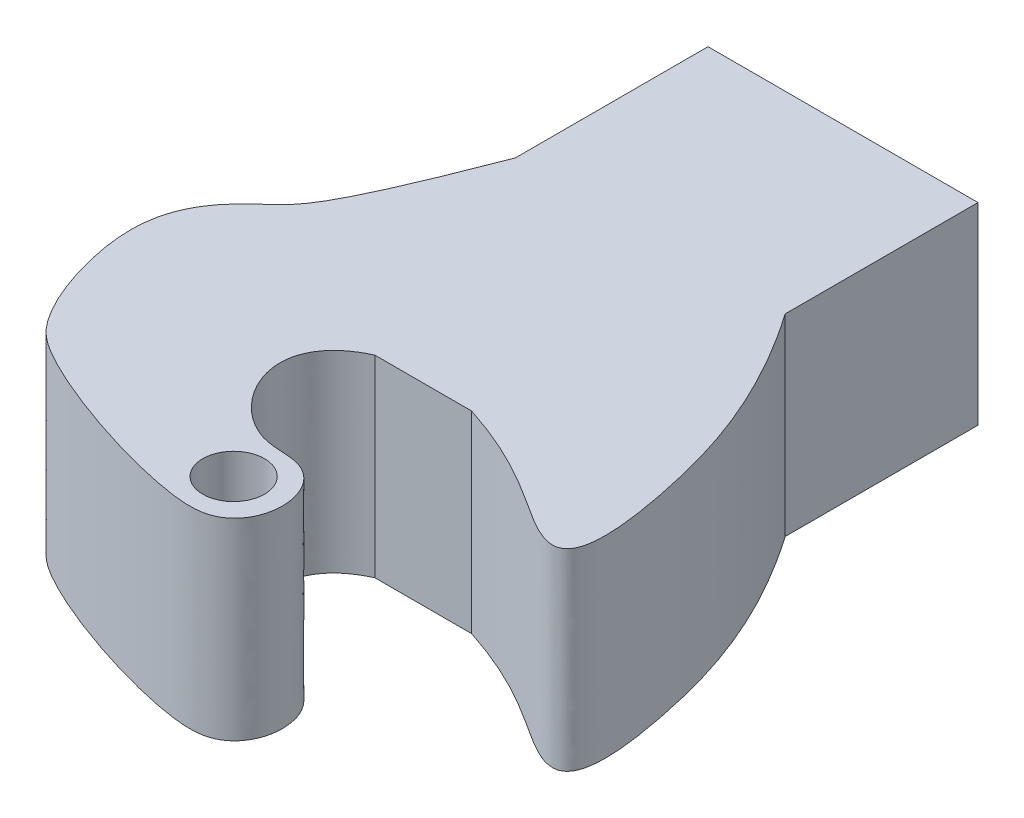
ISO-10303-21;
HEADER;
FILE_DESCRIPTION(('STEP AP214'),'2;1');
FILE_NAME('part.step','',(''),(''),'','','');
FILE_SCHEMA(('AUTOMOTIVE_DESIGN { 1 0 10303 214 1 1 1 1 }'));
ENDSEC;
DATA;
#1=APPLICATION_CONTEXT('core data for automotive mechanical design processes');
#2=APPLICATION_PROTOCOL_DEFINITION('international standard','automotive_design',2000,#1);
#3=PRODUCT_CONTEXT('',#1,'mechanical');
#4=PRODUCT('Part','Part','',(#3));
#5=PRODUCT_RELATED_PRODUCT_CATEGORY('part','',(#4));
#6=PRODUCT_DEFINITION_FORMATION('','',#4);
#7=PRODUCT_DEFINITION_CONTEXT('part definition',#1,'design');
#8=PRODUCT_DEFINITION('design','',#6,#7);
#9=PRODUCT_DEFINITION_SHAPE('','',#8);
#10=(LENGTH_UNIT() NAMED_UNIT(*) SI_UNIT(.MILLI.,.METRE.));
#11=(NAMED_UNIT(*) PLANE_ANGLE_UNIT() SI_UNIT($,.RADIAN.));
#12=(NAMED_UNIT(*) SI_UNIT($,.STERADIAN.) SOLID_ANGLE_UNIT());
#13=UNCERTAINTY_MEASURE_WITH_UNIT(LENGTH_MEASURE(1.E-05),#10,'distance_accuracy_value','');
#14=(GEOMETRIC_REPRESENTATION_CONTEXT(3) GLOBAL_UNCERTAINTY_ASSIGNED_CONTEXT((#13)) GLOBAL_UNIT_ASSIGNED_CONTEXT((#10,
#11,#12)) REPRESENTATION_CONTEXT('',''));
#15=CARTESIAN_POINT('',(0.,0.,0.));
#16=DIRECTION('',(0.,0.,1.));
#17=DIRECTION('',(1.,0.,0.));
#18=AXIS2_PLACEMENT_3D('',#15,#16,#17);
#19=CARTESIAN_POINT('',(175.,-125.,250.));
#20=DIRECTION('',(-1.,0.,0.));
#21=DIRECTION('',(0.,0.,1.));
#22=AXIS2_PLACEMENT_3D('',#19,#20,#21);
#23=PLANE('',#22);
#24=DIRECTION('',(0.,1.,0.));
#25=VECTOR('',#24,1.);
#26=CARTESIAN_POINT('',(175.,-125.,0.));
#27=LINE('',#26,#25);
#28=CARTESIAN_POINT('',(175.,-125.,0.));
#29=VERTEX_POINT('',#28);
#30=CARTESIAN_POINT('',(175.,125.,0.));
#31=VERTEX_POINT('',#30);
#32=EDGE_CURVE('E177',#29,#31,#27,.T.);
#33=ORIENTED_EDGE('',*,*,#32,.T.);
#34=DIRECTION('',(0.,0.,-1.));
#35=VECTOR('',#34,1.);
#36=CARTESIAN_POINT('',(175.,125.,250.));
#37=LINE('',#36,#35);
#38=CARTESIAN_POINT('',(175.,125.,250.));
#39=VERTEX_POINT('',#38);
#40=EDGE_CURVE('E11',#39,#31,#37,.T.);
#41=ORIENTED_EDGE('',*,*,#40,.F.);
#42=DIRECTION('',(0.,1.,0.));
#43=VECTOR('',#42,1.);
#44=CARTESIAN_POINT('',(175.,-125.,250.));
#45=LINE('',#44,#43);
#46=CARTESIAN_POINT('',(175.,-125.,250.));
#47=VERTEX_POINT('',#46);
#48=EDGE_CURVE('E179',#47,#39,#45,.T.);
#49=ORIENTED_EDGE('',*,*,#48,.F.);
#50=DIRECTION('',(0.,0.,-1.));
#51=VECTOR('',#50,1.);
#52=CARTESIAN_POINT('',(175.,-125.,250.));
#53=LINE('',#52,#51);
#54=EDGE_CURVE('E50',#47,#29,#53,.T.);
#55=ORIENTED_EDGE('',*,*,#54,.T.);
#56=EDGE_LOOP('',(#33,#41,#49,#55));
#57=FACE_BOUND('',#56,.T.);
#58=ADVANCED_FACE('F34',(#57),#23,.F.);
#59=CARTESIAN_POINT('',(-175.,125.,250.));
#60=DIRECTION('',(0.,-1.,0.));
#61=DIRECTION('',(0.,0.,-1.));
#62=AXIS2_PLACEMENT_3D('',#59,#60,#61);
#63=PLANE('',#62);
#64=DIRECTION('',(-1.,0.,0.));
#65=VECTOR('',#64,1.);
#66=CARTESIAN_POINT('',(-175.,125.,0.));
#67=LINE('',#66,#65);
#68=CARTESIAN_POINT('',(-175.,125.,0.));
#69=VERTEX_POINT('',#68);
#70=EDGE_CURVE('E156',#31,#69,#67,.T.);
#71=ORIENTED_EDGE('',*,*,#70,.T.);
#72=DIRECTION('',(0.,0.,-1.));
#73=VECTOR('',#72,1.);
#74=CARTESIAN_POINT('',(-175.,125.,250.));
#75=LINE('',#74,#73);
#76=CARTESIAN_POINT('',(-175.,125.,250.));
#77=VERTEX_POINT('',#76);
#78=EDGE_CURVE('E42',#77,#69,#75,.T.);
#79=ORIENTED_EDGE('',*,*,#78,.F.);
#80=CARTESIAN_POINT('',(-175.,125.,250.));
#81=CARTESIAN_POINT('',(-243.158689552223,125.,426.743473278941));
#82=CARTESIAN_POINT('',(-279.701762469466,125.,458.647578572171));
#83=CARTESIAN_POINT('',(-372.289259305635,125.,544.030243143078));
#84=CARTESIAN_POINT('',(-313.337421001662,125.,725.664643323685));
#85=CARTESIAN_POINT('',(-239.027684169651,125.,788.310970630175));
#86=CARTESIAN_POINT('',(-69.7669227205413,125.,847.841545559742));
#87=CARTESIAN_POINT('',(79.8248252096729,125.,857.588069072725));
#88=CARTESIAN_POINT('',(77.5307653460707,125.,724.034365353266));
#89=CARTESIAN_POINT('',(-68.9596639627069,125.,737.752024236189));
#90=CARTESIAN_POINT('',(-144.328050069521,125.,608.05483316108));
#91=CARTESIAN_POINT('',(-44.7617198290106,125.,562.257161455482));
#92=B_SPLINE_CURVE_WITH_KNOTS('',3,(#80,#81,#82,#83,#84,#85,#86,#87,#88,#89,#90,#91),
.UNSPECIFIED.,.F.,.F.,(4,1,1,1,1,1,1,1,1,4),(0.,0.137379521248285,0.290337807767186,
0.419114901732025,0.452202058869164,0.602430787997529,0.641831510394512,0.806808560442013,
0.844687622528155,1.),.UNSPECIFIED.);
#93=CARTESIAN_POINT('',(-44.7617198290149,125.,562.257161455484));
#94=VERTEX_POINT('',#93);
#95=EDGE_CURVE('E116',#77,#94,#92,.T.);
#96=ORIENTED_EDGE('',*,*,#95,.T.);
#97=DIRECTION('',(1.,0.,0.));
#98=VECTOR('',#97,1.);
#99=CARTESIAN_POINT('',(0.,125.,562.257161455484));
#100=LINE('',#99,#98);
#101=CARTESIAN_POINT('',(80.8956409538588,125.,562.257161455484));
#102=VERTEX_POINT('',#101);
#103=EDGE_CURVE('E161',#94,#102,#100,.T.);
#104=ORIENTED_EDGE('',*,*,#103,.T.);
#105=CARTESIAN_POINT('',(80.8956409538588,125.,562.257161455484));
#106=CARTESIAN_POINT('',(172.431287344357,125.,592.316314523608));
#107=CARTESIAN_POINT('',(262.31430280409,125.,669.613832445554));
#108=CARTESIAN_POINT('',(342.133537357133,125.,676.640646608673));
#109=CARTESIAN_POINT('',(255.419582956668,125.,365.169937009999));
#110=CARTESIAN_POINT('',(175.,125.,250.));
#111=B_SPLINE_CURVE_WITH_KNOTS('',3,(#105,#106,#107,#108,#109,#110),.UNSPECIFIED.,.F.,.F.,(4,1,
1,4),(0.,0.370060597977417,0.815514954714594,1.),.UNSPECIFIED.);
#112=EDGE_CURVE('E97',#102,#39,#111,.T.);
#113=ORIENTED_EDGE('',*,*,#112,.T.);
#114=ORIENTED_EDGE('',*,*,#40,.T.);
#115=EDGE_LOOP('',(#71,#79,#96,#104,#113,#114));
#116=FACE_BOUND('',#115,.T.);
#117=CARTESIAN_POINT('',(0.,125.,790.));
#118=DIRECTION('',(0.,1.,0.));
#119=DIRECTION('',(0.,0.,1.));
#120=AXIS2_PLACEMENT_3D('',#117,#118,#119);
#121=CIRCLE('',#120,40.);
#122=CARTESIAN_POINT('',(0.,125.,830.));
#123=VERTEX_POINT('',#122);
#124=EDGE_CURVE('E159',#123,#123,#121,.T.);
#125=ORIENTED_EDGE('',*,*,#124,.F.);
#126=EDGE_LOOP('',(#125));
#127=FACE_BOUND('',#126,.T.);
#128=ADVANCED_FACE('F148',(#116,#127),#63,.F.);
#129=CARTESIAN_POINT('',(-175.,-125.,250.));
#130=DIRECTION('',(1.,0.,0.));
#131=DIRECTION('',(0.,0.,-1.));
#132=AXIS2_PLACEMENT_3D('',#129,#130,#131);
#133=PLANE('',#132);
#134=DIRECTION('',(0.,-1.,0.));
#135=VECTOR('',#134,1.);
#136=CARTESIAN_POINT('',(-175.,-125.,0.));
#137=LINE('',#136,#135);
#138=CARTESIAN_POINT('',(-175.,-125.,0.));
#139=VERTEX_POINT('',#138);
#140=EDGE_CURVE('E68',#69,#139,#137,.T.);
#141=ORIENTED_EDGE('',*,*,#140,.T.);
#142=DIRECTION('',(0.,0.,-1.));
#143=VECTOR('',#142,1.);
#144=CARTESIAN_POINT('',(-175.,-125.,250.));
#145=LINE('',#144,#143);
#146=CARTESIAN_POINT('',(-175.,-125.,250.));
#147=VERTEX_POINT('',#146);
#148=EDGE_CURVE('E189',#147,#139,#145,.T.);
#149=ORIENTED_EDGE('',*,*,#148,.F.);
#150=DIRECTION('',(0.,-1.,0.));
#151=VECTOR('',#150,1.);
#152=CARTESIAN_POINT('',(-175.,-125.,250.));
#153=LINE('',#152,#151);
#154=EDGE_CURVE('E181',#77,#147,#153,.T.);
#155=ORIENTED_EDGE('',*,*,#154,.F.);
#156=ORIENTED_EDGE('',*,*,#78,.T.);
#157=EDGE_LOOP('',(#141,#149,#155,#156));
#158=FACE_BOUND('',#157,.T.);
#159=ADVANCED_FACE('F146',(#158),#133,.F.);
#160=CARTESIAN_POINT('',(-175.,-125.,250.));
#161=DIRECTION('',(0.,1.,0.));
#162=DIRECTION('',(0.,0.,1.));
#163=AXIS2_PLACEMENT_3D('',#160,#161,#162);
#164=PLANE('',#163);
#165=DIRECTION('',(1.,0.,0.));
#166=VECTOR('',#165,1.);
#167=CARTESIAN_POINT('',(-175.,-125.,0.));
#168=LINE('',#167,#166);
#169=EDGE_CURVE('E71',#139,#29,#168,.T.);
#170=ORIENTED_EDGE('',*,*,#169,.T.);
#171=ORIENTED_EDGE('',*,*,#54,.F.);
#172=CARTESIAN_POINT('',(80.8956409538588,-125.,562.257161455484));
#173=CARTESIAN_POINT('',(172.431287344357,-125.,592.316314523608));
#174=CARTESIAN_POINT('',(262.31430280409,-125.,669.613832445554));
#175=CARTESIAN_POINT('',(342.133537357133,-125.,676.640646608673));
#176=CARTESIAN_POINT('',(255.419582956668,-125.,365.169937009999));
#177=CARTESIAN_POINT('',(175.,-125.,250.));
#178=B_SPLINE_CURVE_WITH_KNOTS('',3,(#172,#173,#174,#175,#176,#177),.UNSPECIFIED.,.F.,.F.,(4,1,
1,4),(0.,0.370060597977417,0.815514954714594,1.),.UNSPECIFIED.);
#179=CARTESIAN_POINT('',(80.8956409538588,-125.,562.257161455484));
#180=VERTEX_POINT('',#179);
#181=EDGE_CURVE('E95',#180,#47,#178,.T.);
#182=ORIENTED_EDGE('',*,*,#181,.F.);
#183=DIRECTION('',(1.,0.,0.));
#184=VECTOR('',#183,1.);
#185=CARTESIAN_POINT('',(0.,-125.,562.257161455484));
#186=LINE('',#185,#184);
#187=CARTESIAN_POINT('',(-44.7617198290149,-125.,562.257161455484));
#188=VERTEX_POINT('',#187);
#189=EDGE_CURVE('E109',#188,#180,#186,.T.);
#190=ORIENTED_EDGE('',*,*,#189,.F.);
#191=CARTESIAN_POINT('',(-175.,-125.,250.));
#192=CARTESIAN_POINT('',(-243.158689552223,-125.,426.743473278941));
#193=CARTESIAN_POINT('',(-279.701762469466,-125.,458.647578572171));
#194=CARTESIAN_POINT('',(-372.289259305635,-125.,544.030243143078));
#195=CARTESIAN_POINT('',(-313.337421001662,-125.,725.664643323685));
#196=CARTESIAN_POINT('',(-239.027684169651,-125.,788.310970630175));
#197=CARTESIAN_POINT('',(-69.7669227205413,-125.,847.841545559742));
#198=CARTESIAN_POINT('',(79.8248252096729,-125.,857.588069072725));
#199=CARTESIAN_POINT('',(77.5307653460707,-125.,724.034365353266));
#200=CARTESIAN_POINT('',(-68.9596639627069,-125.,737.752024236189));
#201=CARTESIAN_POINT('',(-144.328050069521,-125.,608.05483316108));
#202=CARTESIAN_POINT('',(-44.7617198290106,-125.,562.257161455482));
#203=B_SPLINE_CURVE_WITH_KNOTS('',3,(#191,#192,#193,#194,#195,#196,#197,#198,#199,#200,#201,
#202),.UNSPECIFIED.,.F.,.F.,(4,1,1,1,1,1,1,1,1,4),(0.,0.137379521248285,0.290337807767186,
0.419114901732025,0.452202058869164,0.602430787997529,0.641831510394512,0.806808560442013,
0.844687622528155,1.),.UNSPECIFIED.);
#204=EDGE_CURVE('E103',#147,#188,#203,.T.);
#205=ORIENTED_EDGE('',*,*,#204,.F.);
#206=ORIENTED_EDGE('',*,*,#148,.T.);
#207=EDGE_LOOP('',(#170,#171,#182,#190,#205,#206));
#208=FACE_BOUND('',#207,.T.);
#209=CARTESIAN_POINT('',(0.,-125.,790.));
#210=DIRECTION('',(0.,1.,0.));
#211=DIRECTION('',(0.,0.,1.));
#212=AXIS2_PLACEMENT_3D('',#209,#210,#211);
#213=CIRCLE('',#212,40.);
#214=CARTESIAN_POINT('',(0.,-125.,830.));
#215=VERTEX_POINT('',#214);
#216=EDGE_CURVE('E113',#215,#215,#213,.T.);
#217=ORIENTED_EDGE('',*,*,#216,.T.);
#218=EDGE_LOOP('',(#217));
#219=FACE_BOUND('',#218,.T.);
#220=ADVANCED_FACE('F106',(#208,#219),#164,.F.);
#221=CARTESIAN_POINT('',(0.,0.,0.));
#222=DIRECTION('',(0.,0.,-1.));
#223=DIRECTION('',(-1.,0.,0.));
#224=AXIS2_PLACEMENT_3D('',#221,#222,#223);
#225=PLANE('',#224);
#226=ORIENTED_EDGE('',*,*,#32,.F.);
#227=ORIENTED_EDGE('',*,*,#169,.F.);
#228=ORIENTED_EDGE('',*,*,#140,.F.);
#229=ORIENTED_EDGE('',*,*,#70,.F.);
#230=EDGE_LOOP('',(#226,#227,#228,#229));
#231=FACE_BOUND('',#230,.T.);
#232=ADVANCED_FACE('F137',(#231),#225,.T.);
#233=CARTESIAN_POINT('',(0.,-125.,562.257161455484));
#234=DIRECTION('',(0.,0.,1.));
#235=DIRECTION('',(1.,0.,0.));
#236=AXIS2_PLACEMENT_3D('',#233,#234,#235);
#237=PLANE('',#236);
#238=ORIENTED_EDGE('',*,*,#103,.F.);
#239=DIRECTION('',(0.,1.,0.));
#240=VECTOR('',#239,1.);
#241=CARTESIAN_POINT('',(-44.7617198290149,-125.,562.257161455484));
#242=LINE('',#241,#240);
#243=EDGE_CURVE('E102',#188,#94,#242,.T.);
#244=ORIENTED_EDGE('',*,*,#243,.F.);
#245=ORIENTED_EDGE('',*,*,#189,.T.);
#246=DIRECTION('',(0.,1.,0.));
#247=VECTOR('',#246,1.);
#248=CARTESIAN_POINT('',(80.8956409538588,-125.,562.257161455484));
#249=LINE('',#248,#247);
#250=EDGE_CURVE('E93',#180,#102,#249,.T.);
#251=ORIENTED_EDGE('',*,*,#250,.T.);
#252=EDGE_LOOP('',(#238,#244,#245,#251));
#253=FACE_BOUND('',#252,.T.);
#254=ADVANCED_FACE('F112',(#253),#237,.T.);
#255=DIRECTION('',(0.,1.,0.));
#256=VECTOR('',#255,1.);
#257=SURFACE_OF_LINEAR_EXTRUSION('',#203,#256);
#258=ORIENTED_EDGE('',*,*,#95,.F.);
#259=ORIENTED_EDGE('',*,*,#154,.T.);
#260=ORIENTED_EDGE('',*,*,#204,.T.);
#261=ORIENTED_EDGE('',*,*,#243,.T.);
#262=EDGE_LOOP('',(#258,#259,#260,#261));
#263=FACE_BOUND('',#262,.T.);
#264=ADVANCED_FACE('F134',(#263),#257,.T.);
#265=CARTESIAN_POINT('',(0.,-125.,790.));
#266=DIRECTION('',(0.,1.,0.));
#267=DIRECTION('',(0.,0.,1.));
#268=AXIS2_PLACEMENT_3D('',#265,#266,#267);
#269=CYLINDRICAL_SURFACE('',#268,40.);
#270=ORIENTED_EDGE('',*,*,#216,.F.);
#271=EDGE_LOOP('',(#270));
#272=FACE_BOUND('',#271,.T.);
#273=ORIENTED_EDGE('',*,*,#124,.T.);
#274=EDGE_LOOP('',(#273));
#275=FACE_BOUND('',#274,.T.);
#276=ADVANCED_FACE('F133',(#272,#275),#269,.F.);
#277=DIRECTION('',(0.,1.,0.));
#278=VECTOR('',#277,1.);
#279=SURFACE_OF_LINEAR_EXTRUSION('',#178,#278);
#280=ORIENTED_EDGE('',*,*,#112,.F.);
#281=ORIENTED_EDGE('',*,*,#250,.F.);
#282=ORIENTED_EDGE('',*,*,#181,.T.);
#283=ORIENTED_EDGE('',*,*,#48,.T.);
#284=EDGE_LOOP('',(#280,#281,#282,#283));
#285=FACE_BOUND('',#284,.T.);
#286=ADVANCED_FACE('F94',(#285),#279,.T.);
#287=CLOSED_SHELL('',(#58,#128,#159,#220,#232,#254,#264,#276,#286));
#288=MANIFOLD_SOLID_BREP('B2',#287);
#289=ADVANCED_BREP_SHAPE_REPRESENTATION('',(#18,#288),#14);
#290=SHAPE_DEFINITION_REPRESENTATION(#9,#289);
ENDSEC;
END-ISO-10303-21;
